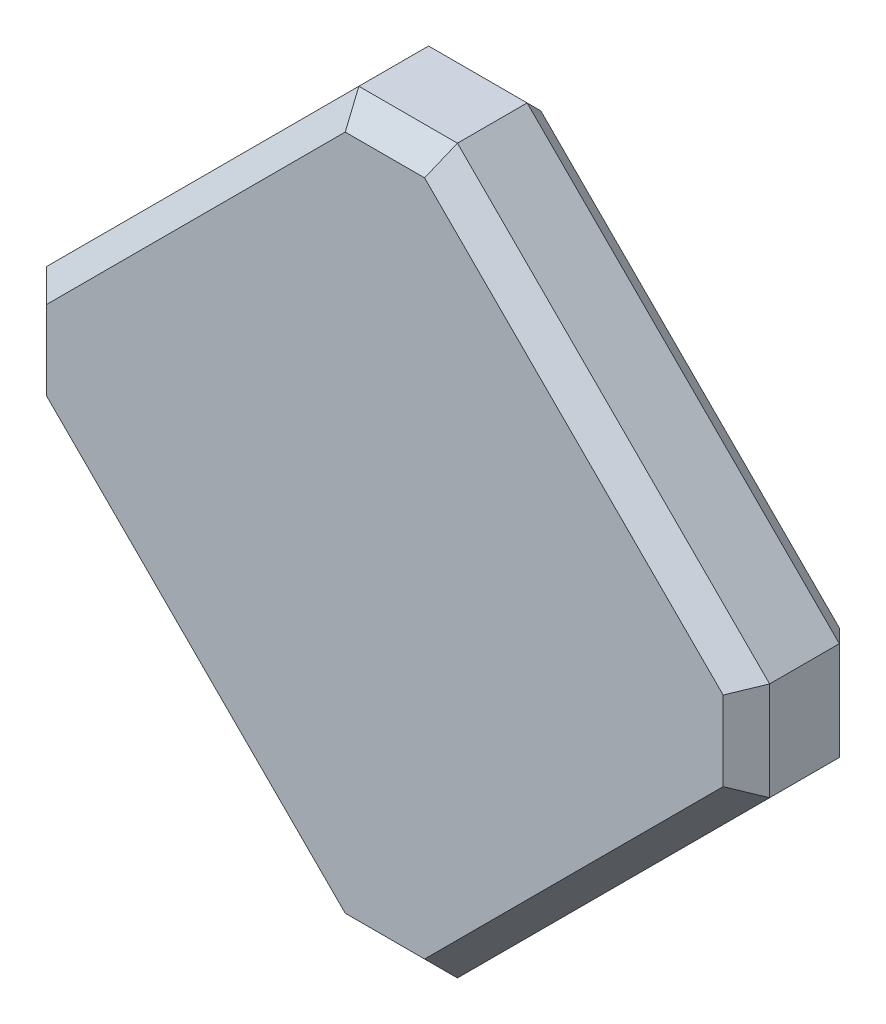
ISO-10303-21;
HEADER;
FILE_DESCRIPTION(('STEP AP214'),'2;1');
FILE_NAME('part.step','',(''),(''),'','','');
FILE_SCHEMA(('AUTOMOTIVE_DESIGN { 1 0 10303 214 1 1 1 1 }'));
ENDSEC;
DATA;
#1=APPLICATION_CONTEXT('core data for automotive mechanical design processes');
#2=APPLICATION_PROTOCOL_DEFINITION('international standard','automotive_design',2000,#1);
#3=PRODUCT_CONTEXT('',#1,'mechanical');
#4=PRODUCT('Part','Part','',(#3));
#5=PRODUCT_RELATED_PRODUCT_CATEGORY('part','',(#4));
#6=PRODUCT_DEFINITION_FORMATION('','',#4);
#7=PRODUCT_DEFINITION_CONTEXT('part definition',#1,'design');
#8=PRODUCT_DEFINITION('design','',#6,#7);
#9=PRODUCT_DEFINITION_SHAPE('','',#8);
#10=(LENGTH_UNIT() NAMED_UNIT(*) SI_UNIT(.MILLI.,.METRE.));
#11=(NAMED_UNIT(*) PLANE_ANGLE_UNIT() SI_UNIT($,.RADIAN.));
#12=(NAMED_UNIT(*) SI_UNIT($,.STERADIAN.) SOLID_ANGLE_UNIT());
#13=UNCERTAINTY_MEASURE_WITH_UNIT(LENGTH_MEASURE(1.E-05),#10,'distance_accuracy_value','');
#14=(GEOMETRIC_REPRESENTATION_CONTEXT(3) GLOBAL_UNCERTAINTY_ASSIGNED_CONTEXT((#13)) GLOBAL_UNIT_ASSIGNED_CONTEXT((#10,
#11,#12)) REPRESENTATION_CONTEXT('',''));
#15=CARTESIAN_POINT('',(0.,0.,0.));
#16=DIRECTION('',(0.,0.,1.));
#17=DIRECTION('',(1.,0.,0.));
#18=AXIS2_PLACEMENT_3D('',#15,#16,#17);
#19=CARTESIAN_POINT('',(8.185452E-12,670.867546192147,-320.357743681072));
#20=DIRECTION('',(0.,0.,-1.));
#21=DIRECTION('',(-1.,0.,0.));
#22=AXIS2_PLACEMENT_3D('',#19,#20,#21);
#23=PLANE('',#22);
#24=DIRECTION('',(6.83304223428924E-13,1.,-6.83304223428924E-13));
#25=VECTOR('',#24,1.);
#26=CARTESIAN_POINT('',(-14.5563491861019,667.332012286235,-320.357743681073));
#27=LINE('',#26,#25);
#28=CARTESIAN_POINT('',(-14.556349186103,665.624905505047,-320.357743681072));
#29=VERTEX_POINT('',#28);
#30=CARTESIAN_POINT('',(-14.5563491861007,669.03911906742,-320.357743681073));
#31=VERTEX_POINT('',#30);
#32=EDGE_CURVE('E157',#29,#31,#27,.T.);
#33=ORIENTED_EDGE('',*,*,#32,.F.);
#34=DIRECTION('',(-0.707106781185577,0.707106781187518,0.));
#35=VECTOR('',#34,1.);
#36=CARTESIAN_POINT('',(-1.70710678120328,652.775663100112,-320.357743681072));
#37=LINE('',#36,#35);
#38=CARTESIAN_POINT('',(-1.7071067812027,652.77566310011,-320.357743681073));
#39=VERTEX_POINT('',#38);
#40=EDGE_CURVE('E142',#39,#29,#37,.T.);
#41=ORIENTED_EDGE('',*,*,#40,.F.);
#42=DIRECTION('',(1.,-6.83304223428924E-13,6.83304223428924E-13));
#43=VECTOR('',#42,1.);
#44=CARTESIAN_POINT('',(-1.72804E-11,652.775663100108,-320.357743681073));
#45=LINE('',#44,#43);
#46=CARTESIAN_POINT('',(1.70710678117019,652.775663100107,-320.357743681072));
#47=VERTEX_POINT('',#46);
#48=EDGE_CURVE('E128',#47,#39,#45,.F.);
#49=ORIENTED_EDGE('',*,*,#48,.F.);
#50=DIRECTION('',(-0.707106781187316,-0.707106781185779,-2.81044791682869E-13));
#51=VECTOR('',#50,1.);
#52=CARTESIAN_POINT('',(14.5563491861014,665.62490550501,-320.357743681067));
#53=LINE('',#52,#51);
#54=CARTESIAN_POINT('',(14.5563491861014,665.624905505013,-320.35774368107));
#55=VERTEX_POINT('',#54);
#56=EDGE_CURVE('E20',#55,#47,#53,.T.);
#57=ORIENTED_EDGE('',*,*,#56,.F.);
#58=DIRECTION('',(6.83304223428924E-13,1.,6.83304223428924E-13));
#59=VECTOR('',#58,1.);
#60=CARTESIAN_POINT('',(14.5563491861015,667.3320122862,-320.357743681073));
#61=LINE('',#60,#59);
#62=CARTESIAN_POINT('',(14.5563491861026,669.039119067388,-320.357743681072));
#63=VERTEX_POINT('',#62);
#64=EDGE_CURVE('E179',#63,#55,#61,.F.);
#65=ORIENTED_EDGE('',*,*,#64,.F.);
#66=DIRECTION('',(0.707106781185584,-0.707106781187511,0.));
#67=VECTOR('',#66,1.);
#68=CARTESIAN_POINT('',(1.70710678120261,681.888361472323,-320.357743681072));
#69=LINE('',#68,#67);
#70=CARTESIAN_POINT('',(1.70710678120079,681.888361472325,-320.357743681073));
#71=VERTEX_POINT('',#70);
#72=EDGE_CURVE('E170',#71,#63,#69,.T.);
#73=ORIENTED_EDGE('',*,*,#72,.F.);
#74=DIRECTION('',(1.,-6.83304223428924E-13,-6.83304223428924E-13));
#75=VECTOR('',#74,1.);
#76=CARTESIAN_POINT('',(1.682565E-11,681.888361472326,-320.357743681073));
#77=LINE('',#76,#75);
#78=CARTESIAN_POINT('',(-1.70710678116903,681.888361472325,-320.357743681074));
#79=VERTEX_POINT('',#78);
#80=EDGE_CURVE('E167',#79,#71,#77,.T.);
#81=ORIENTED_EDGE('',*,*,#80,.F.);
#82=DIRECTION('',(0.707106781187329,0.707106781185767,-2.62715783529648E-13));
#83=VECTOR('',#82,1.);
#84=CARTESIAN_POINT('',(-14.5563491860984,669.039119067421,-320.357743681072));
#85=LINE('',#84,#83);
#86=EDGE_CURVE('E162',#31,#79,#85,.T.);
#87=ORIENTED_EDGE('',*,*,#86,.F.);
#88=EDGE_LOOP('',(#33,#41,#49,#57,#65,#73,#81,#87));
#89=FACE_BOUND('',#88,.T.);
#90=ADVANCED_FACE('F17',(#89),#23,.F.);
#91=CARTESIAN_POINT('',(10.2530483271994,660.614497864928,-320.857743681072));
#92=DIRECTION('',(0.499999999999335,-0.500000000000701,0.707106781186522));
#93=DIRECTION('',(0.,-0.816496580927335,-0.577350269190179));
#94=AXIS2_PLACEMENT_3D('',#91,#92,#93);
#95=PLANE('',#94);
#96=DIRECTION('',(-0.707106781187514,-0.707106781185581,0.));
#97=VECTOR('',#96,1.);
#98=CARTESIAN_POINT('',(10.6066017177918,660.260944474334,-321.357743681072));
#99=LINE('',#98,#97);
#100=CARTESIAN_POINT('',(2.12132034354158,651.775663100107,-321.357743681072));
#101=VERTEX_POINT('',#100);
#102=CARTESIAN_POINT('',(15.5563491860999,665.210691942637,-321.357743681069));
#103=VERTEX_POINT('',#102);
#104=EDGE_CURVE('E181',#101,#103,#99,.F.);
#105=ORIENTED_EDGE('',*,*,#104,.T.);
#106=DIRECTION('',(0.678598344545523,-0.281084637715453,-0.678598344545908));
#107=VECTOR('',#106,1.);
#108=CARTESIAN_POINT('',(14.556349186098,665.624905505014,-320.357743681072));
#109=LINE('',#108,#107);
#110=EDGE_CURVE('E137',#55,#103,#109,.T.);
#111=ORIENTED_EDGE('',*,*,#110,.F.);
#112=ORIENTED_EDGE('',*,*,#56,.T.);
#113=DIRECTION('',(-0.281084637713837,0.67859834454622,0.678598344545881));
#114=VECTOR('',#113,1.);
#115=CARTESIAN_POINT('',(2.12132034354181,651.775663100107,-321.357743681072));
#116=LINE('',#115,#114);
#117=EDGE_CURVE('E134',#101,#47,#116,.T.);
#118=ORIENTED_EDGE('',*,*,#117,.F.);
#119=EDGE_LOOP('',(#105,#111,#112,#118));
#120=FACE_BOUND('',#119,.T.);
#121=ADVANCED_FACE('F133',(#120),#95,.T.);
#122=CARTESIAN_POINT('',(-1.72804E-11,652.27566310011,-320.857743681072));
#123=DIRECTION('',(-9.663381E-13,-0.707106781186548,0.707106781186548));
#124=DIRECTION('',(0.,-0.707106781186548,-0.707106781186548));
#125=AXIS2_PLACEMENT_3D('',#122,#123,#124);
#126=PLANE('',#125);
#127=ORIENTED_EDGE('',*,*,#117,.T.);
#128=ORIENTED_EDGE('',*,*,#48,.T.);
#129=DIRECTION('',(0.281084637715781,0.678598344545422,0.678598344545874));
#130=VECTOR('',#129,1.);
#131=CARTESIAN_POINT('',(-2.12132034357768,651.775663100113,-321.357743681072));
#132=LINE('',#131,#130);
#133=CARTESIAN_POINT('',(-2.12132034357773,651.775663100113,-321.357743681072));
#134=VERTEX_POINT('',#133);
#135=EDGE_CURVE('E144',#134,#39,#132,.T.);
#136=ORIENTED_EDGE('',*,*,#135,.F.);
#137=DIRECTION('',(1.,-1.366608E-12,0.));
#138=VECTOR('',#137,1.);
#139=CARTESIAN_POINT('',(-1.773515E-11,651.77566310011,-321.357743681072));
#140=LINE('',#139,#138);
#141=EDGE_CURVE('E149',#101,#134,#140,.F.);
#142=ORIENTED_EDGE('',*,*,#141,.F.);
#143=EDGE_LOOP('',(#127,#128,#136,#142));
#144=FACE_BOUND('',#143,.T.);
#145=ADVANCED_FACE('F147',(#144),#126,.T.);
#146=CARTESIAN_POINT('',(-10.2530483272108,660.614497864956,-320.857743681072));
#147=DIRECTION('',(-0.500000000000701,-0.499999999999335,0.707106781186522));
#148=DIRECTION('',(0.816496580927335,0.,0.577350269190179));
#149=AXIS2_PLACEMENT_3D('',#146,#147,#148);
#150=PLANE('',#149);
#151=ORIENTED_EDGE('',*,*,#40,.T.);
#152=DIRECTION('',(0.678598344546208,0.281084637714027,0.678598344545815));
#153=VECTOR('',#152,1.);
#154=CARTESIAN_POINT('',(-15.5563491861036,665.210691942675,-321.357743681072));
#155=LINE('',#154,#153);
#156=CARTESIAN_POINT('',(-15.5563491861031,665.210691942675,-321.357743681072));
#157=VERTEX_POINT('',#156);
#158=EDGE_CURVE('E154',#157,#29,#155,.T.);
#159=ORIENTED_EDGE('',*,*,#158,.F.);
#160=DIRECTION('',(-0.707106781185581,0.707106781187514,0.));
#161=VECTOR('',#160,1.);
#162=CARTESIAN_POINT('',(-10.6066017178046,660.260944474363,-321.357743681072));
#163=LINE('',#162,#161);
#164=EDGE_CURVE('E186',#157,#134,#163,.F.);
#165=ORIENTED_EDGE('',*,*,#164,.T.);
#166=ORIENTED_EDGE('',*,*,#135,.T.);
#167=EDGE_LOOP('',(#151,#159,#165,#166));
#168=FACE_BOUND('',#167,.T.);
#169=ADVANCED_FACE('F362',(#168),#150,.T.);
#170=CARTESIAN_POINT('',(-15.0563491861008,667.332012286235,-320.857743681072));
#171=DIRECTION('',(-0.707106781186548,9.663381E-13,0.707106781186547));
#172=DIRECTION('',(0.707106781186547,0.,0.707106781186548));
#173=AXIS2_PLACEMENT_3D('',#170,#171,#172);
#174=PLANE('',#173);
#175=ORIENTED_EDGE('',*,*,#158,.T.);
#176=ORIENTED_EDGE('',*,*,#32,.T.);
#177=DIRECTION('',(0.678598344545571,-0.281084637715538,0.678598344545825));
#178=VECTOR('',#177,1.);
#179=CARTESIAN_POINT('',(-15.556349186098,669.453332629795,-321.357743681072));
#180=LINE('',#179,#178);
#181=CARTESIAN_POINT('',(-15.556349186098,669.453332629795,-321.357743681072));
#182=VERTEX_POINT('',#181);
#183=EDGE_CURVE('E159',#182,#31,#180,.T.);
#184=ORIENTED_EDGE('',*,*,#183,.F.);
#185=DIRECTION('',(-1.366608E-12,-1.,0.));
#186=VECTOR('',#185,1.);
#187=CARTESIAN_POINT('',(-15.5563491861008,667.332012286235,-321.357743681072));
#188=LINE('',#187,#186);
#189=EDGE_CURVE('E194',#157,#182,#188,.F.);
#190=ORIENTED_EDGE('',*,*,#189,.F.);
#191=EDGE_LOOP('',(#175,#176,#184,#190));
#192=FACE_BOUND('',#191,.T.);
#193=ADVANCED_FACE('F351',(#192),#174,.T.);
#194=CARTESIAN_POINT('',(-6.71751442125515,677.585060613428,-320.857743681072));
#195=DIRECTION('',(-0.499999999999335,0.500000000000701,0.707106781186522));
#196=DIRECTION('',(0.,-0.816496580927335,0.577350269190179));
#197=AXIS2_PLACEMENT_3D('',#194,#195,#196);
#198=PLANE('',#197);
#199=ORIENTED_EDGE('',*,*,#86,.T.);
#200=DIRECTION('',(0.281084637713706,-0.678598344546266,0.67859834454589));
#201=VECTOR('',#200,1.);
#202=CARTESIAN_POINT('',(-2.12132034354227,682.888361472328,-321.357743681072));
#203=LINE('',#202,#201);
#204=CARTESIAN_POINT('',(-2.1213203435386,682.888361472324,-321.357743681074));
#205=VERTEX_POINT('',#204);
#206=EDGE_CURVE('E164',#205,#79,#203,.T.);
#207=ORIENTED_EDGE('',*,*,#206,.F.);
#208=DIRECTION('',(0.707106781187514,0.707106781185581,0.));
#209=VECTOR('',#208,1.);
#210=CARTESIAN_POINT('',(-7.07106781184757,677.938614004022,-321.357743681072));
#211=LINE('',#210,#209);
#212=EDGE_CURVE('E197',#205,#182,#211,.F.);
#213=ORIENTED_EDGE('',*,*,#212,.T.);
#214=ORIENTED_EDGE('',*,*,#183,.T.);
#215=EDGE_LOOP('',(#199,#207,#213,#214));
#216=FACE_BOUND('',#215,.T.);
#217=ADVANCED_FACE('F353',(#216),#198,.T.);
#218=CARTESIAN_POINT('',(1.682565E-11,682.388361472325,-320.857743681072));
#219=DIRECTION('',(9.663381E-13,0.707106781186548,0.707106781186548));
#220=DIRECTION('',(0.,-0.707106781186548,0.707106781186548));
#221=AXIS2_PLACEMENT_3D('',#218,#219,#220);
#222=PLANE('',#221);
#223=ORIENTED_EDGE('',*,*,#206,.T.);
#224=ORIENTED_EDGE('',*,*,#80,.T.);
#225=DIRECTION('',(-0.281084637715985,-0.678598344545286,0.678598344545926));
#226=VECTOR('',#225,1.);
#227=CARTESIAN_POINT('',(2.12132034357735,682.888361472322,-321.357743681072));
#228=LINE('',#227,#226);
#229=CARTESIAN_POINT('',(2.12132034357732,682.888361472322,-321.357743681072));
#230=VERTEX_POINT('',#229);
#231=EDGE_CURVE('E172',#230,#71,#228,.T.);
#232=ORIENTED_EDGE('',*,*,#231,.F.);
#233=DIRECTION('',(-1.,1.366608E-12,0.));
#234=VECTOR('',#233,1.);
#235=CARTESIAN_POINT('',(1.773515E-11,682.888361472325,-321.357743681072));
#236=LINE('',#235,#234);
#237=EDGE_CURVE('E205',#205,#230,#236,.F.);
#238=ORIENTED_EDGE('',*,*,#237,.F.);
#239=EDGE_LOOP('',(#223,#224,#232,#238));
#240=FACE_BOUND('',#239,.T.);
#241=ADVANCED_FACE('F333',(#240),#222,.T.);
#242=CARTESIAN_POINT('',(6.71751442128243,677.585060613417,-320.857743681072));
#243=DIRECTION('',(0.500000000000701,0.499999999999335,0.707106781186522));
#244=DIRECTION('',(0.816496580927335,0.,-0.577350269190179));
#245=AXIS2_PLACEMENT_3D('',#242,#243,#244);
#246=PLANE('',#245);
#247=DIRECTION('',(0.707106781185581,-0.707106781187514,0.));
#248=VECTOR('',#247,1.);
#249=CARTESIAN_POINT('',(7.07106781187622,677.93861400401,-321.357743681072));
#250=LINE('',#249,#248);
#251=CARTESIAN_POINT('',(15.5563491861026,669.45333262976,-321.357743681072));
#252=VERTEX_POINT('',#251);
#253=EDGE_CURVE('E210',#252,#230,#250,.F.);
#254=ORIENTED_EDGE('',*,*,#253,.T.);
#255=ORIENTED_EDGE('',*,*,#231,.T.);
#256=ORIENTED_EDGE('',*,*,#72,.T.);
#257=DIRECTION('',(-0.678598344546191,-0.281084637714111,0.678598344545797));
#258=VECTOR('',#257,1.);
#259=CARTESIAN_POINT('',(15.5563491861031,669.45333262976,-321.357743681072));
#260=LINE('',#259,#258);
#261=EDGE_CURVE('E176',#252,#63,#260,.T.);
#262=ORIENTED_EDGE('',*,*,#261,.F.);
#263=EDGE_LOOP('',(#254,#255,#256,#262));
#264=FACE_BOUND('',#263,.T.);
#265=ADVANCED_FACE('F336',(#264),#246,.T.);
#266=CARTESIAN_POINT('',(15.0563491861003,667.3320122862,-320.857743681072));
#267=DIRECTION('',(0.707106781186548,-9.663381E-13,0.707106781186548));
#268=DIRECTION('',(0.707106781186548,0.,-0.707106781186548));
#269=AXIS2_PLACEMENT_3D('',#266,#267,#268);
#270=PLANE('',#269);
#271=ORIENTED_EDGE('',*,*,#261,.T.);
#272=ORIENTED_EDGE('',*,*,#64,.T.);
#273=ORIENTED_EDGE('',*,*,#110,.T.);
#274=DIRECTION('',(1.366608E-12,1.,0.));
#275=VECTOR('',#274,1.);
#276=CARTESIAN_POINT('',(15.5563491861003,667.3320122862,-321.357743681072));
#277=LINE('',#276,#275);
#278=EDGE_CURVE('E216',#252,#103,#277,.F.);
#279=ORIENTED_EDGE('',*,*,#278,.F.);
#280=EDGE_LOOP('',(#271,#272,#273,#279));
#281=FACE_BOUND('',#280,.T.);
#282=ADVANCED_FACE('F338',(#281),#270,.T.);
#283=CARTESIAN_POINT('',(10.6066017177918,660.260944474334,-322.857743681072));
#284=DIRECTION('',(-0.707106781185581,0.707106781187514,0.));
#285=DIRECTION('',(-0.707106781187514,-0.707106781185581,0.));
#286=AXIS2_PLACEMENT_3D('',#283,#284,#285);
#287=PLANE('',#286);
#288=DIRECTION('',(0.,0.,1.));
#289=VECTOR('',#288,1.);
#290=CARTESIAN_POINT('',(2.12132034354181,651.775663100107,-322.857743681072));
#291=LINE('',#290,#289);
#292=CARTESIAN_POINT('',(2.12132034354171,651.775663100107,-324.357743681072));
#293=VERTEX_POINT('',#292);
#294=EDGE_CURVE('E183',#293,#101,#291,.T.);
#295=ORIENTED_EDGE('',*,*,#294,.F.);
#296=DIRECTION('',(-0.707106781187321,-0.707106781185775,2.71712477079318E-13));
#297=VECTOR('',#296,1.);
#298=CARTESIAN_POINT('',(15.5563491861007,665.210691942636,-324.357743681077));
#299=LINE('',#298,#297);
#300=CARTESIAN_POINT('',(15.5563491861016,665.210691942636,-324.357743681072));
#301=VERTEX_POINT('',#300);
#302=EDGE_CURVE('E222',#301,#293,#299,.T.);
#303=ORIENTED_EDGE('',*,*,#302,.F.);
#304=DIRECTION('',(0.,0.,1.));
#305=VECTOR('',#304,1.);
#306=CARTESIAN_POINT('',(15.5563491860974,665.21069194264,-322.857743681072));
#307=LINE('',#306,#305);
#308=EDGE_CURVE('E219',#103,#301,#307,.F.);
#309=ORIENTED_EDGE('',*,*,#308,.F.);
#310=ORIENTED_EDGE('',*,*,#104,.F.);
#311=EDGE_LOOP('',(#295,#303,#309,#310));
#312=FACE_BOUND('',#311,.T.);
#313=ADVANCED_FACE('F340',(#312),#287,.F.);
#314=CARTESIAN_POINT('',(-1.773515E-11,651.77566310011,-322.857743681072));
#315=DIRECTION('',(-1.366608E-12,-1.,0.));
#316=DIRECTION('',(1.,-1.366608E-12,0.));
#317=AXIS2_PLACEMENT_3D('',#314,#315,#316);
#318=PLANE('',#317);
#319=ORIENTED_EDGE('',*,*,#141,.T.);
#320=DIRECTION('',(0.,0.,1.));
#321=VECTOR('',#320,1.);
#322=CARTESIAN_POINT('',(-2.1213203435778,651.775663100113,-322.857743681072));
#323=LINE('',#322,#321);
#324=CARTESIAN_POINT('',(-2.12132034357805,651.775663100112,-324.357743681071));
#325=VERTEX_POINT('',#324);
#326=EDGE_CURVE('E189',#134,#325,#323,.F.);
#327=ORIENTED_EDGE('',*,*,#326,.T.);
#328=DIRECTION('',(1.,-6.83304223428924E-13,-6.83304223428924E-13));
#329=VECTOR('',#328,1.);
#330=CARTESIAN_POINT('',(-1.72804E-11,651.775663100108,-324.357743681071));
#331=LINE('',#330,#329);
#332=EDGE_CURVE('E228',#293,#325,#331,.F.);
#333=ORIENTED_EDGE('',*,*,#332,.F.);
#334=ORIENTED_EDGE('',*,*,#294,.T.);
#335=EDGE_LOOP('',(#319,#327,#333,#334));
#336=FACE_BOUND('',#335,.T.);
#337=ADVANCED_FACE('F342',(#336),#318,.T.);
#338=CARTESIAN_POINT('',(-10.6066017178046,660.260944474363,-322.857743681072));
#339=DIRECTION('',(0.707106781187514,0.707106781185581,0.));
#340=DIRECTION('',(-0.707106781185581,0.707106781187514,0.));
#341=AXIS2_PLACEMENT_3D('',#338,#339,#340);
#342=PLANE('',#341);
#343=ORIENTED_EDGE('',*,*,#326,.F.);
#344=ORIENTED_EDGE('',*,*,#164,.F.);
#345=DIRECTION('',(0.,0.,1.));
#346=VECTOR('',#345,1.);
#347=CARTESIAN_POINT('',(-15.5563491861037,665.210691942675,-322.857743681072));
#348=LINE('',#347,#346);
#349=CARTESIAN_POINT('',(-15.5563491861034,665.210691942675,-324.357743681072));
#350=VERTEX_POINT('',#349);
#351=EDGE_CURVE('E191',#350,#157,#348,.T.);
#352=ORIENTED_EDGE('',*,*,#351,.F.);
#353=DIRECTION('',(-0.707106781185586,0.707106781187509,0.));
#354=VECTOR('',#353,1.);
#355=CARTESIAN_POINT('',(-2.12132034357768,651.775663100113,-324.357743681072));
#356=LINE('',#355,#354);
#357=EDGE_CURVE('E234',#325,#350,#356,.T.);
#358=ORIENTED_EDGE('',*,*,#357,.F.);
#359=EDGE_LOOP('',(#343,#344,#352,#358));
#360=FACE_BOUND('',#359,.T.);
#361=ADVANCED_FACE('F346',(#360),#342,.F.);
#362=CARTESIAN_POINT('',(-15.5563491861008,667.332012286235,-322.857743681072));
#363=DIRECTION('',(-1.,1.366608E-12,0.));
#364=DIRECTION('',(-1.366608E-12,-1.,0.));
#365=AXIS2_PLACEMENT_3D('',#362,#363,#364);
#366=PLANE('',#365);
#367=ORIENTED_EDGE('',*,*,#189,.T.);
#368=DIRECTION('',(0.,0.,1.));
#369=VECTOR('',#368,1.);
#370=CARTESIAN_POINT('',(-15.556349186098,669.453332629795,-322.857743681072));
#371=LINE('',#370,#369);
#372=CARTESIAN_POINT('',(-15.5563491860986,669.453332629795,-324.357743681071));
#373=VERTEX_POINT('',#372);
#374=EDGE_CURVE('E200',#182,#373,#371,.F.);
#375=ORIENTED_EDGE('',*,*,#374,.T.);
#376=DIRECTION('',(6.83304223428924E-13,1.,6.83304223428924E-13));
#377=VECTOR('',#376,1.);
#378=CARTESIAN_POINT('',(-15.5563491861021,667.332012286235,-324.357743681071));
#379=LINE('',#378,#377);
#380=EDGE_CURVE('E240',#350,#373,#379,.T.);
#381=ORIENTED_EDGE('',*,*,#380,.F.);
#382=ORIENTED_EDGE('',*,*,#351,.T.);
#383=EDGE_LOOP('',(#367,#375,#381,#382));
#384=FACE_BOUND('',#383,.T.);
#385=ADVANCED_FACE('F349',(#384),#366,.T.);
#386=CARTESIAN_POINT('',(-7.07106781184757,677.938614004022,-322.857743681072));
#387=DIRECTION('',(0.707106781185581,-0.707106781187514,0.));
#388=DIRECTION('',(0.707106781187514,0.707106781185581,0.));
#389=AXIS2_PLACEMENT_3D('',#386,#387,#388);
#390=PLANE('',#389);
#391=ORIENTED_EDGE('',*,*,#374,.F.);
#392=ORIENTED_EDGE('',*,*,#212,.F.);
#393=DIRECTION('',(0.,0.,1.));
#394=VECTOR('',#393,1.);
#395=CARTESIAN_POINT('',(-2.12132034354227,682.888361472328,-322.857743681072));
#396=LINE('',#395,#394);
#397=CARTESIAN_POINT('',(-2.12132034353787,682.888361472324,-324.357743681071));
#398=VERTEX_POINT('',#397);
#399=EDGE_CURVE('E202',#398,#205,#396,.T.);
#400=ORIENTED_EDGE('',*,*,#399,.F.);
#401=DIRECTION('',(0.707106781187331,0.707106781185764,2.60025918925367E-13));
#402=VECTOR('',#401,1.);
#403=CARTESIAN_POINT('',(-15.556349186098,669.453332629795,-324.357743681072));
#404=LINE('',#403,#402);
#405=EDGE_CURVE('E246',#373,#398,#404,.T.);
#406=ORIENTED_EDGE('',*,*,#405,.F.);
#407=EDGE_LOOP('',(#391,#392,#400,#406));
#408=FACE_BOUND('',#407,.T.);
#409=ADVANCED_FACE('F329',(#408),#390,.F.);
#410=CARTESIAN_POINT('',(1.773515E-11,682.888361472325,-322.857743681072));
#411=DIRECTION('',(1.366608E-12,1.,0.));
#412=DIRECTION('',(-1.,1.366608E-12,0.));
#413=AXIS2_PLACEMENT_3D('',#410,#411,#412);
#414=PLANE('',#413);
#415=ORIENTED_EDGE('',*,*,#237,.T.);
#416=DIRECTION('',(0.,0.,1.));
#417=VECTOR('',#416,1.);
#418=CARTESIAN_POINT('',(2.12132034357752,682.888361472322,-322.857743681072));
#419=LINE('',#418,#417);
#420=CARTESIAN_POINT('',(2.1213203435775,682.888361472322,-324.357743681072));
#421=VERTEX_POINT('',#420);
#422=EDGE_CURVE('E208',#230,#421,#419,.F.);
#423=ORIENTED_EDGE('',*,*,#422,.T.);
#424=DIRECTION('',(1.,-6.83304223428924E-13,6.83304223428924E-13));
#425=VECTOR('',#424,1.);
#426=CARTESIAN_POINT('',(1.682565E-11,682.888361472326,-324.357743681071));
#427=LINE('',#426,#425);
#428=EDGE_CURVE('E252',#398,#421,#427,.T.);
#429=ORIENTED_EDGE('',*,*,#428,.F.);
#430=ORIENTED_EDGE('',*,*,#399,.T.);
#431=EDGE_LOOP('',(#415,#423,#429,#430));
#432=FACE_BOUND('',#431,.T.);
#433=ADVANCED_FACE('F296',(#432),#414,.T.);
#434=CARTESIAN_POINT('',(7.07106781187622,677.93861400401,-322.857743681072));
#435=DIRECTION('',(-0.707106781187514,-0.707106781185581,0.));
#436=DIRECTION('',(0.707106781185581,-0.707106781187514,0.));
#437=AXIS2_PLACEMENT_3D('',#434,#435,#436);
#438=PLANE('',#437);
#439=DIRECTION('',(0.,0.,1.));
#440=VECTOR('',#439,1.);
#441=CARTESIAN_POINT('',(15.5563491861032,669.45333262976,-322.857743681072));
#442=LINE('',#441,#440);
#443=CARTESIAN_POINT('',(15.556349186103,669.45333262976,-324.357743681072));
#444=VERTEX_POINT('',#443);
#445=EDGE_CURVE('E213',#444,#252,#442,.T.);
#446=ORIENTED_EDGE('',*,*,#445,.F.);
#447=DIRECTION('',(0.707106781185587,-0.707106781187508,0.));
#448=VECTOR('',#447,1.);
#449=CARTESIAN_POINT('',(2.12132034357735,682.888361472322,-324.357743681072));
#450=LINE('',#449,#448);
#451=EDGE_CURVE('E255',#421,#444,#450,.T.);
#452=ORIENTED_EDGE('',*,*,#451,.F.);
#453=ORIENTED_EDGE('',*,*,#422,.F.);
#454=ORIENTED_EDGE('',*,*,#253,.F.);
#455=EDGE_LOOP('',(#446,#452,#453,#454));
#456=FACE_BOUND('',#455,.T.);
#457=ADVANCED_FACE('F301',(#456),#438,.F.);
#458=CARTESIAN_POINT('',(15.5563491861003,667.3320122862,-322.857743681072));
#459=DIRECTION('',(1.,-1.366608E-12,0.));
#460=DIRECTION('',(1.366608E-12,1.,0.));
#461=AXIS2_PLACEMENT_3D('',#458,#459,#460);
#462=PLANE('',#461);
#463=ORIENTED_EDGE('',*,*,#278,.T.);
#464=ORIENTED_EDGE('',*,*,#308,.T.);
#465=DIRECTION('',(6.83304223428924E-13,1.,-6.83304223428924E-13));
#466=VECTOR('',#465,1.);
#467=CARTESIAN_POINT('',(15.5563491861016,667.3320122862,-324.357743681071));
#468=LINE('',#467,#466);
#469=EDGE_CURVE('E261',#444,#301,#468,.F.);
#470=ORIENTED_EDGE('',*,*,#469,.F.);
#471=ORIENTED_EDGE('',*,*,#445,.T.);
#472=EDGE_LOOP('',(#463,#464,#470,#471));
#473=FACE_BOUND('',#472,.T.);
#474=ADVANCED_FACE('F304',(#473),#462,.T.);
#475=CARTESIAN_POINT('',(10.2530483271994,660.614497864928,-324.857743681072));
#476=DIRECTION('',(0.499999999999335,-0.500000000000701,-0.707106781186522));
#477=DIRECTION('',(0.,0.816496580927335,-0.577350269190179));
#478=AXIS2_PLACEMENT_3D('',#475,#476,#477);
#479=PLANE('',#478);
#480=DIRECTION('',(-0.707106781187116,-0.707106781185979,0.));
#481=VECTOR('',#480,1.);
#482=CARTESIAN_POINT('',(14.556349186098,665.624905505014,-325.357743681072));
#483=LINE('',#482,#481);
#484=CARTESIAN_POINT('',(14.5563491861008,665.624905505013,-325.357743681074));
#485=VERTEX_POINT('',#484);
#486=CARTESIAN_POINT('',(1.70710678116994,652.775663100108,-325.357743681072));
#487=VERTEX_POINT('',#486);
#488=EDGE_CURVE('E267',#485,#487,#483,.T.);
#489=ORIENTED_EDGE('',*,*,#488,.F.);
#490=DIRECTION('',(-0.678598344545523,0.281084637715453,-0.678598344545908));
#491=VECTOR('',#490,1.);
#492=CARTESIAN_POINT('',(15.5563491860972,665.21069194264,-324.357743681072));
#493=LINE('',#492,#491);
#494=EDGE_CURVE('E264',#301,#485,#493,.T.);
#495=ORIENTED_EDGE('',*,*,#494,.F.);
#496=ORIENTED_EDGE('',*,*,#302,.T.);
#497=DIRECTION('',(0.281084637713837,-0.67859834454622,0.678598344545881));
#498=VECTOR('',#497,1.);
#499=CARTESIAN_POINT('',(1.7071067811703,652.775663100107,-325.357743681072));
#500=LINE('',#499,#498);
#501=EDGE_CURVE('E225',#487,#293,#500,.T.);
#502=ORIENTED_EDGE('',*,*,#501,.F.);
#503=EDGE_LOOP('',(#489,#495,#496,#502));
#504=FACE_BOUND('',#503,.T.);
#505=ADVANCED_FACE('F310',(#504),#479,.T.);
#506=CARTESIAN_POINT('',(-1.72804E-11,652.27566310011,-324.857743681072));
#507=DIRECTION('',(-9.663381E-13,-0.707106781186548,-0.707106781186548));
#508=DIRECTION('',(0.,0.707106781186548,-0.707106781186548));
#509=AXIS2_PLACEMENT_3D('',#506,#507,#508);
#510=PLANE('',#509);
#511=DIRECTION('',(-0.281084637715781,-0.678598344545422,0.678598344545874));
#512=VECTOR('',#511,1.);
#513=CARTESIAN_POINT('',(-1.70710678120328,652.775663100112,-325.357743681072));
#514=LINE('',#513,#512);
#515=CARTESIAN_POINT('',(-1.70710678120219,652.775663100111,-325.357743681072));
#516=VERTEX_POINT('',#515);
#517=EDGE_CURVE('E231',#516,#325,#514,.T.);
#518=ORIENTED_EDGE('',*,*,#517,.F.);
#519=DIRECTION('',(-1.,0.,0.));
#520=VECTOR('',#519,1.);
#521=CARTESIAN_POINT('',(8.185452E-12,652.775663100107,-325.357743681072));
#522=LINE('',#521,#520);
#523=EDGE_CURVE('E270',#487,#516,#522,.T.);
#524=ORIENTED_EDGE('',*,*,#523,.F.);
#525=ORIENTED_EDGE('',*,*,#501,.T.);
#526=ORIENTED_EDGE('',*,*,#332,.T.);
#527=EDGE_LOOP('',(#518,#524,#525,#526));
#528=FACE_BOUND('',#527,.T.);
#529=ADVANCED_FACE('F315',(#528),#510,.T.);
#530=CARTESIAN_POINT('',(-10.2530483272108,660.614497864956,-324.857743681072));
#531=DIRECTION('',(-0.500000000000701,-0.499999999999335,-0.707106781186522));
#532=DIRECTION('',(-0.816496580927335,0.,0.577350269190179));
#533=AXIS2_PLACEMENT_3D('',#530,#531,#532);
#534=PLANE('',#533);
#535=ORIENTED_EDGE('',*,*,#357,.T.);
#536=DIRECTION('',(-0.678598344546208,-0.281084637714027,0.678598344545815));
#537=VECTOR('',#536,1.);
#538=CARTESIAN_POINT('',(-14.5563491861031,665.624905505047,-325.357743681072));
#539=LINE('',#538,#537);
#540=CARTESIAN_POINT('',(-14.5563491861024,665.624905505047,-325.357743681073));
#541=VERTEX_POINT('',#540);
#542=EDGE_CURVE('E237',#541,#350,#539,.T.);
#543=ORIENTED_EDGE('',*,*,#542,.F.);
#544=DIRECTION('',(-0.707106781185571,0.707106781187524,0.));
#545=VECTOR('',#544,1.);
#546=CARTESIAN_POINT('',(-1.70710678120349,652.775663100112,-325.357743681072));
#547=LINE('',#546,#545);
#548=EDGE_CURVE('E273',#516,#541,#547,.T.);
#549=ORIENTED_EDGE('',*,*,#548,.F.);
#550=ORIENTED_EDGE('',*,*,#517,.T.);
#551=EDGE_LOOP('',(#535,#543,#549,#550));
#552=FACE_BOUND('',#551,.T.);
#553=ADVANCED_FACE('F318',(#552),#534,.T.);
#554=CARTESIAN_POINT('',(-15.0563491861008,667.332012286235,-324.857743681072));
#555=DIRECTION('',(-0.707106781186548,9.663381E-13,-0.707106781186547));
#556=DIRECTION('',(-0.707106781186547,0.,0.707106781186548));
#557=AXIS2_PLACEMENT_3D('',#554,#555,#556);
#558=PLANE('',#557);
#559=DIRECTION('',(-0.678598344545571,0.281084637715538,0.678598344545825));
#560=VECTOR('',#559,1.);
#561=CARTESIAN_POINT('',(-14.5563491860984,669.039119067421,-325.357743681072));
#562=LINE('',#561,#560);
#563=CARTESIAN_POINT('',(-14.5563491860996,669.03911906742,-325.357743681072));
#564=VERTEX_POINT('',#563);
#565=EDGE_CURVE('E243',#564,#373,#562,.T.);
#566=ORIENTED_EDGE('',*,*,#565,.F.);
#567=DIRECTION('',(0.,1.,0.));
#568=VECTOR('',#567,1.);
#569=CARTESIAN_POINT('',(-14.556349186103,670.867546192147,-325.357743681072));
#570=LINE('',#569,#568);
#571=EDGE_CURVE('E276',#541,#564,#570,.T.);
#572=ORIENTED_EDGE('',*,*,#571,.F.);
#573=ORIENTED_EDGE('',*,*,#542,.T.);
#574=ORIENTED_EDGE('',*,*,#380,.T.);
#575=EDGE_LOOP('',(#566,#572,#573,#574));
#576=FACE_BOUND('',#575,.T.);
#577=ADVANCED_FACE('F322',(#576),#558,.T.);
#578=CARTESIAN_POINT('',(-6.71751442125515,677.585060613428,-324.857743681072));
#579=DIRECTION('',(-0.499999999999335,0.500000000000701,-0.707106781186522));
#580=DIRECTION('',(0.,0.816496580927335,0.577350269190179));
#581=AXIS2_PLACEMENT_3D('',#578,#579,#580);
#582=PLANE('',#581);
#583=ORIENTED_EDGE('',*,*,#405,.T.);
#584=DIRECTION('',(-0.281084637713706,0.678598344546266,0.67859834454589));
#585=VECTOR('',#584,1.);
#586=CARTESIAN_POINT('',(-1.70710678117075,681.888361472327,-325.357743681072));
#587=LINE('',#586,#585);
#588=CARTESIAN_POINT('',(-1.70710678116883,681.888361472325,-325.35774368107));
#589=VERTEX_POINT('',#588);
#590=EDGE_CURVE('E249',#589,#398,#587,.T.);
#591=ORIENTED_EDGE('',*,*,#590,.F.);
#592=DIRECTION('',(0.707106781187145,0.70710678118595,0.));
#593=VECTOR('',#592,1.);
#594=CARTESIAN_POINT('',(-14.5563491860985,669.039119067421,-325.357743681072));
#595=LINE('',#594,#593);
#596=EDGE_CURVE('E279',#564,#589,#595,.T.);
#597=ORIENTED_EDGE('',*,*,#596,.F.);
#598=ORIENTED_EDGE('',*,*,#565,.T.);
#599=EDGE_LOOP('',(#583,#591,#597,#598));
#600=FACE_BOUND('',#599,.T.);
#601=ADVANCED_FACE('F325',(#600),#582,.T.);
#602=CARTESIAN_POINT('',(1.682565E-11,682.388361472325,-324.857743681072));
#603=DIRECTION('',(9.663381E-13,0.707106781186548,-0.707106781186548));
#604=DIRECTION('',(0.,0.707106781186548,0.707106781186548));
#605=AXIS2_PLACEMENT_3D('',#602,#603,#604);
#606=PLANE('',#605);
#607=DIRECTION('',(0.281084637715985,0.678598344545286,0.678598344545926));
#608=VECTOR('',#607,1.);
#609=CARTESIAN_POINT('',(1.70710678120261,681.888361472323,-325.357743681072));
#610=LINE('',#609,#608);
#611=CARTESIAN_POINT('',(1.7071067812016,681.888361472324,-325.357743681072));
#612=VERTEX_POINT('',#611);
#613=EDGE_CURVE('E257',#612,#421,#610,.T.);
#614=ORIENTED_EDGE('',*,*,#613,.F.);
#615=DIRECTION('',(-1.,0.,0.));
#616=VECTOR('',#615,1.);
#617=CARTESIAN_POINT('',(8.185452E-12,681.888361472327,-325.357743681072));
#618=LINE('',#617,#616);
#619=EDGE_CURVE('E282',#589,#612,#618,.F.);
#620=ORIENTED_EDGE('',*,*,#619,.F.);
#621=ORIENTED_EDGE('',*,*,#590,.T.);
#622=ORIENTED_EDGE('',*,*,#428,.T.);
#623=EDGE_LOOP('',(#614,#620,#621,#622));
#624=FACE_BOUND('',#623,.T.);
#625=ADVANCED_FACE('F293',(#624),#606,.T.);
#626=CARTESIAN_POINT('',(6.71751442128243,677.585060613417,-324.857743681072));
#627=DIRECTION('',(0.500000000000701,0.499999999999335,-0.707106781186522));
#628=DIRECTION('',(-0.816496580927335,0.,-0.577350269190179));
#629=AXIS2_PLACEMENT_3D('',#626,#627,#628);
#630=PLANE('',#629);
#631=DIRECTION('',(0.707106781185585,-0.70710678118751,0.));
#632=VECTOR('',#631,1.);
#633=CARTESIAN_POINT('',(1.70710678120258,681.888361472323,-325.357743681072));
#634=LINE('',#633,#632);
#635=CARTESIAN_POINT('',(14.556349186102,669.039119067388,-325.357743681073));
#636=VERTEX_POINT('',#635);
#637=EDGE_CURVE('E26',#612,#636,#634,.T.);
#638=ORIENTED_EDGE('',*,*,#637,.F.);
#639=ORIENTED_EDGE('',*,*,#613,.T.);
#640=ORIENTED_EDGE('',*,*,#451,.T.);
#641=DIRECTION('',(0.678598344546191,0.281084637714111,0.678598344545797));
#642=VECTOR('',#641,1.);
#643=CARTESIAN_POINT('',(14.5563491861026,669.039119067388,-325.357743681072));
#644=LINE('',#643,#642);
#645=EDGE_CURVE('E35',#636,#444,#644,.T.);
#646=ORIENTED_EDGE('',*,*,#645,.F.);
#647=EDGE_LOOP('',(#638,#639,#640,#646));
#648=FACE_BOUND('',#647,.T.);
#649=ADVANCED_FACE('F289',(#648),#630,.T.);
#650=CARTESIAN_POINT('',(15.0563491861003,667.3320122862,-324.857743681072));
#651=DIRECTION('',(0.707106781186548,-9.663381E-13,-0.707106781186548));
#652=DIRECTION('',(-0.707106781186548,0.,-0.707106781186548));
#653=AXIS2_PLACEMENT_3D('',#650,#651,#652);
#654=PLANE('',#653);
#655=ORIENTED_EDGE('',*,*,#494,.T.);
#656=DIRECTION('',(0.,1.,0.));
#657=VECTOR('',#656,1.);
#658=CARTESIAN_POINT('',(14.5563491861026,670.867546192147,-325.357743681072));
#659=LINE('',#658,#657);
#660=EDGE_CURVE('E11',#636,#485,#659,.F.);
#661=ORIENTED_EDGE('',*,*,#660,.F.);
#662=ORIENTED_EDGE('',*,*,#645,.T.);
#663=ORIENTED_EDGE('',*,*,#469,.T.);
#664=EDGE_LOOP('',(#655,#661,#662,#663));
#665=FACE_BOUND('',#664,.T.);
#666=ADVANCED_FACE('F308',(#665),#654,.T.);
#667=CARTESIAN_POINT('',(8.185452E-12,670.867546192147,-325.357743681072));
#668=DIRECTION('',(0.,0.,-1.));
#669=DIRECTION('',(-1.,0.,0.));
#670=AXIS2_PLACEMENT_3D('',#667,#668,#669);
#671=PLANE('',#670);
#672=ORIENTED_EDGE('',*,*,#637,.T.);
#673=ORIENTED_EDGE('',*,*,#660,.T.);
#674=ORIENTED_EDGE('',*,*,#488,.T.);
#675=ORIENTED_EDGE('',*,*,#523,.T.);
#676=ORIENTED_EDGE('',*,*,#548,.T.);
#677=ORIENTED_EDGE('',*,*,#571,.T.);
#678=ORIENTED_EDGE('',*,*,#596,.T.);
#679=ORIENTED_EDGE('',*,*,#619,.T.);
#680=EDGE_LOOP('',(#672,#673,#674,#675,#676,#677,#678,#679));
#681=FACE_BOUND('',#680,.T.);
#682=ADVANCED_FACE('F287',(#681),#671,.T.);
#683=CLOSED_SHELL('',(#90,#121,#145,#169,#193,#217,#241,#265,#282,#313,#337,#361,#385,#409,#433,
#457,#474,#505,#529,#553,#577,#601,#625,#649,#666,#682));
#684=MANIFOLD_SOLID_BREP('B1',#683);
#685=ADVANCED_BREP_SHAPE_REPRESENTATION('',(#18,#684),#14);
#686=SHAPE_DEFINITION_REPRESENTATION(#9,#685);
ENDSEC;
END-ISO-10303-21;
